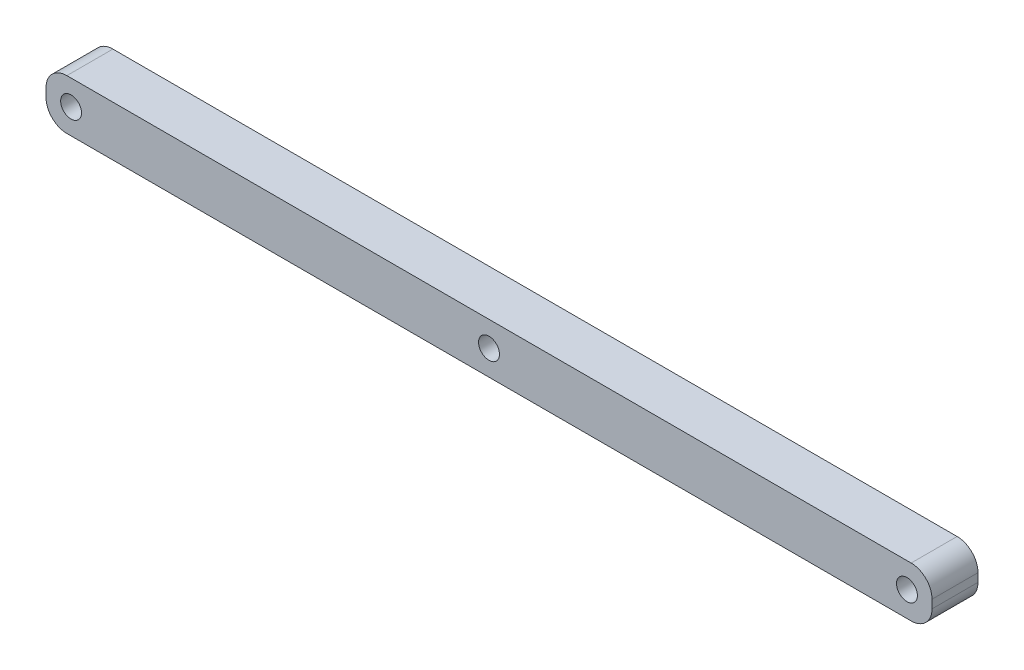
ISO-10303-21;
HEADER;
FILE_DESCRIPTION(('STEP AP214'),'2;1');
FILE_NAME('part.step','',(''),(''),'','','');
FILE_SCHEMA(('AUTOMOTIVE_DESIGN { 1 0 10303 214 1 1 1 1 }'));
ENDSEC;
DATA;
#1=APPLICATION_CONTEXT('core data for automotive mechanical design processes');
#2=APPLICATION_PROTOCOL_DEFINITION('international standard','automotive_design',2000,#1);
#3=PRODUCT_CONTEXT('',#1,'mechanical');
#4=PRODUCT('Part','Part','',(#3));
#5=PRODUCT_RELATED_PRODUCT_CATEGORY('part','',(#4));
#6=PRODUCT_DEFINITION_FORMATION('','',#4);
#7=PRODUCT_DEFINITION_CONTEXT('part definition',#1,'design');
#8=PRODUCT_DEFINITION('design','',#6,#7);
#9=PRODUCT_DEFINITION_SHAPE('','',#8);
#10=(LENGTH_UNIT() NAMED_UNIT(*) SI_UNIT(.MILLI.,.METRE.));
#11=(NAMED_UNIT(*) PLANE_ANGLE_UNIT() SI_UNIT($,.RADIAN.));
#12=(NAMED_UNIT(*) SI_UNIT($,.STERADIAN.) SOLID_ANGLE_UNIT());
#13=UNCERTAINTY_MEASURE_WITH_UNIT(LENGTH_MEASURE(1.E-05),#10,'distance_accuracy_value','');
#14=(GEOMETRIC_REPRESENTATION_CONTEXT(3) GLOBAL_UNCERTAINTY_ASSIGNED_CONTEXT((#13)) GLOBAL_UNIT_ASSIGNED_CONTEXT((#10,
#11,#12)) REPRESENTATION_CONTEXT('',''));
#15=CARTESIAN_POINT('',(0.,0.,0.));
#16=DIRECTION('',(0.,0.,1.));
#17=DIRECTION('',(1.,0.,0.));
#18=AXIS2_PLACEMENT_3D('',#15,#16,#17);
#19=CARTESIAN_POINT('',(0.,0.,22.));
#20=DIRECTION('',(0.,0.,-1.));
#21=DIRECTION('',(-1.,0.,0.));
#22=AXIS2_PLACEMENT_3D('',#19,#20,#21);
#23=PLANE('',#22);
#24=DIRECTION('',(0.,1.,0.));
#25=VECTOR('',#24,1.);
#26=CARTESIAN_POINT('',(424.,0.,22.));
#27=LINE('',#26,#25);
#28=CARTESIAN_POINT('',(424.,10.,22.));
#29=VERTEX_POINT('',#28);
#30=CARTESIAN_POINT('',(424.,14.,22.));
#31=VERTEX_POINT('',#30);
#32=EDGE_CURVE('E172',#29,#31,#27,.T.);
#33=ORIENTED_EDGE('',*,*,#32,.T.);
#34=CARTESIAN_POINT('',(414.,14.,22.));
#35=DIRECTION('',(0.,0.,-1.));
#36=DIRECTION('',(-1.,0.,0.));
#37=AXIS2_PLACEMENT_3D('',#34,#35,#36);
#38=CIRCLE('',#37,10.);
#39=CARTESIAN_POINT('',(414.,24.,22.));
#40=VERTEX_POINT('',#39);
#41=EDGE_CURVE('E149',#31,#40,#38,.F.);
#42=ORIENTED_EDGE('',*,*,#41,.T.);
#43=DIRECTION('',(-1.,0.,0.));
#44=VECTOR('',#43,1.);
#45=CARTESIAN_POINT('',(0.,24.,22.));
#46=LINE('',#45,#44);
#47=CARTESIAN_POINT('',(10.,24.,22.));
#48=VERTEX_POINT('',#47);
#49=EDGE_CURVE('E120',#40,#48,#46,.T.);
#50=ORIENTED_EDGE('',*,*,#49,.T.);
#51=CARTESIAN_POINT('',(10.,14.,22.));
#52=DIRECTION('',(0.,0.,-1.));
#53=DIRECTION('',(-1.,0.,0.));
#54=AXIS2_PLACEMENT_3D('',#51,#52,#53);
#55=CIRCLE('',#54,10.);
#56=CARTESIAN_POINT('',(0.,14.,22.));
#57=VERTEX_POINT('',#56);
#58=EDGE_CURVE('E145',#48,#57,#55,.F.);
#59=ORIENTED_EDGE('',*,*,#58,.T.);
#60=DIRECTION('',(0.,-1.,0.));
#61=VECTOR('',#60,1.);
#62=CARTESIAN_POINT('',(0.,0.,22.));
#63=LINE('',#62,#61);
#64=CARTESIAN_POINT('',(0.,10.,22.));
#65=VERTEX_POINT('',#64);
#66=EDGE_CURVE('E128',#57,#65,#63,.T.);
#67=ORIENTED_EDGE('',*,*,#66,.T.);
#68=CARTESIAN_POINT('',(10.,10.,22.));
#69=DIRECTION('',(0.,0.,-1.));
#70=DIRECTION('',(-1.,0.,0.));
#71=AXIS2_PLACEMENT_3D('',#68,#69,#70);
#72=CIRCLE('',#71,10.);
#73=CARTESIAN_POINT('',(10.,0.,22.));
#74=VERTEX_POINT('',#73);
#75=EDGE_CURVE('E55',#65,#74,#72,.F.);
#76=ORIENTED_EDGE('',*,*,#75,.T.);
#77=DIRECTION('',(1.,0.,0.));
#78=VECTOR('',#77,1.);
#79=CARTESIAN_POINT('',(0.,0.,22.));
#80=LINE('',#79,#78);
#81=CARTESIAN_POINT('',(414.,0.,22.));
#82=VERTEX_POINT('',#81);
#83=EDGE_CURVE('E131',#74,#82,#80,.T.);
#84=ORIENTED_EDGE('',*,*,#83,.T.);
#85=CARTESIAN_POINT('',(414.,10.,22.));
#86=DIRECTION('',(0.,0.,-1.));
#87=DIRECTION('',(-1.,0.,0.));
#88=AXIS2_PLACEMENT_3D('',#85,#86,#87);
#89=CIRCLE('',#88,10.);
#90=EDGE_CURVE('E147',#82,#29,#89,.F.);
#91=ORIENTED_EDGE('',*,*,#90,.T.);
#92=EDGE_LOOP('',(#33,#42,#50,#59,#67,#76,#84,#91));
#93=FACE_BOUND('',#92,.T.);
#94=CARTESIAN_POINT('',(12.,12.,22.));
#95=DIRECTION('',(0.,0.,1.));
#96=DIRECTION('',(1.,0.,0.));
#97=AXIS2_PLACEMENT_3D('',#94,#95,#96);
#98=CIRCLE('',#97,5.);
#99=CARTESIAN_POINT('',(17.,12.,22.));
#100=VERTEX_POINT('',#99);
#101=EDGE_CURVE('E168',#100,#100,#98,.T.);
#102=ORIENTED_EDGE('',*,*,#101,.F.);
#103=EDGE_LOOP('',(#102));
#104=FACE_BOUND('',#103,.T.);
#105=CARTESIAN_POINT('',(412.,12.,22.));
#106=DIRECTION('',(0.,0.,1.));
#107=DIRECTION('',(1.,0.,0.));
#108=AXIS2_PLACEMENT_3D('',#105,#106,#107);
#109=CIRCLE('',#108,4.99999999999999);
#110=CARTESIAN_POINT('',(417.,12.,22.));
#111=VERTEX_POINT('',#110);
#112=EDGE_CURVE('E178',#111,#111,#109,.T.);
#113=ORIENTED_EDGE('',*,*,#112,.F.);
#114=EDGE_LOOP('',(#113));
#115=FACE_BOUND('',#114,.T.);
#116=CARTESIAN_POINT('',(212.,12.,22.));
#117=DIRECTION('',(0.,0.,1.));
#118=DIRECTION('',(1.,0.,0.));
#119=AXIS2_PLACEMENT_3D('',#116,#117,#118);
#120=CIRCLE('',#119,4.99999999999999);
#121=CARTESIAN_POINT('',(217.,12.,22.));
#122=VERTEX_POINT('',#121);
#123=EDGE_CURVE('E184',#122,#122,#120,.T.);
#124=ORIENTED_EDGE('',*,*,#123,.F.);
#125=EDGE_LOOP('',(#124));
#126=FACE_BOUND('',#125,.T.);
#127=ADVANCED_FACE('F33',(#93,#104,#115,#126),#23,.F.);
#128=CARTESIAN_POINT('',(0.,0.,0.));
#129=DIRECTION('',(0.,0.,-1.));
#130=DIRECTION('',(-1.,0.,0.));
#131=AXIS2_PLACEMENT_3D('',#128,#129,#130);
#132=PLANE('',#131);
#133=CARTESIAN_POINT('',(412.,12.,0.));
#134=DIRECTION('',(0.,0.,1.));
#135=DIRECTION('',(1.,0.,0.));
#136=AXIS2_PLACEMENT_3D('',#133,#134,#135);
#137=CIRCLE('',#136,4.99999999999999);
#138=CARTESIAN_POINT('',(417.,12.,0.));
#139=VERTEX_POINT('',#138);
#140=EDGE_CURVE('E181',#139,#139,#137,.T.);
#141=ORIENTED_EDGE('',*,*,#140,.T.);
#142=EDGE_LOOP('',(#141));
#143=FACE_BOUND('',#142,.T.);
#144=DIRECTION('',(-1.,0.,0.));
#145=VECTOR('',#144,1.);
#146=CARTESIAN_POINT('',(0.,24.,0.));
#147=LINE('',#146,#145);
#148=CARTESIAN_POINT('',(414.,24.,0.));
#149=VERTEX_POINT('',#148);
#150=CARTESIAN_POINT('',(10.,24.,0.));
#151=VERTEX_POINT('',#150);
#152=EDGE_CURVE('E117',#149,#151,#147,.T.);
#153=ORIENTED_EDGE('',*,*,#152,.F.);
#154=CARTESIAN_POINT('',(414.,14.,0.));
#155=DIRECTION('',(0.,0.,-1.));
#156=DIRECTION('',(-1.,0.,0.));
#157=AXIS2_PLACEMENT_3D('',#154,#155,#156);
#158=CIRCLE('',#157,10.);
#159=CARTESIAN_POINT('',(424.,14.,0.));
#160=VERTEX_POINT('',#159);
#161=EDGE_CURVE('E100',#149,#160,#158,.T.);
#162=ORIENTED_EDGE('',*,*,#161,.T.);
#163=DIRECTION('',(0.,1.,0.));
#164=VECTOR('',#163,1.);
#165=CARTESIAN_POINT('',(424.,0.,0.));
#166=LINE('',#165,#164);
#167=CARTESIAN_POINT('',(424.,10.,0.));
#168=VERTEX_POINT('',#167);
#169=EDGE_CURVE('E129',#168,#160,#166,.T.);
#170=ORIENTED_EDGE('',*,*,#169,.F.);
#171=CARTESIAN_POINT('',(414.,10.,0.));
#172=DIRECTION('',(0.,0.,-1.));
#173=DIRECTION('',(-1.,0.,0.));
#174=AXIS2_PLACEMENT_3D('',#171,#172,#173);
#175=CIRCLE('',#174,10.);
#176=CARTESIAN_POINT('',(414.,0.,0.));
#177=VERTEX_POINT('',#176);
#178=EDGE_CURVE('E111',#168,#177,#175,.T.);
#179=ORIENTED_EDGE('',*,*,#178,.T.);
#180=DIRECTION('',(1.,0.,0.));
#181=VECTOR('',#180,1.);
#182=CARTESIAN_POINT('',(0.,0.,0.));
#183=LINE('',#182,#181);
#184=CARTESIAN_POINT('',(10.,0.,0.));
#185=VERTEX_POINT('',#184);
#186=EDGE_CURVE('E133',#185,#177,#183,.T.);
#187=ORIENTED_EDGE('',*,*,#186,.F.);
#188=CARTESIAN_POINT('',(10.,10.,0.));
#189=DIRECTION('',(0.,0.,-1.));
#190=DIRECTION('',(-1.,0.,0.));
#191=AXIS2_PLACEMENT_3D('',#188,#189,#190);
#192=CIRCLE('',#191,10.);
#193=CARTESIAN_POINT('',(0.,10.,0.));
#194=VERTEX_POINT('',#193);
#195=EDGE_CURVE('E121',#185,#194,#192,.T.);
#196=ORIENTED_EDGE('',*,*,#195,.T.);
#197=DIRECTION('',(0.,-1.,0.));
#198=VECTOR('',#197,1.);
#199=CARTESIAN_POINT('',(0.,0.,0.));
#200=LINE('',#199,#198);
#201=CARTESIAN_POINT('',(0.,14.,0.));
#202=VERTEX_POINT('',#201);
#203=EDGE_CURVE('E160',#202,#194,#200,.T.);
#204=ORIENTED_EDGE('',*,*,#203,.F.);
#205=CARTESIAN_POINT('',(10.,14.,0.));
#206=DIRECTION('',(0.,0.,-1.));
#207=DIRECTION('',(-1.,0.,0.));
#208=AXIS2_PLACEMENT_3D('',#205,#206,#207);
#209=CIRCLE('',#208,10.);
#210=EDGE_CURVE('E127',#202,#151,#209,.T.);
#211=ORIENTED_EDGE('',*,*,#210,.T.);
#212=EDGE_LOOP('',(#153,#162,#170,#179,#187,#196,#204,#211));
#213=FACE_BOUND('',#212,.T.);
#214=CARTESIAN_POINT('',(12.,12.,0.));
#215=DIRECTION('',(0.,0.,1.));
#216=DIRECTION('',(1.,0.,0.));
#217=AXIS2_PLACEMENT_3D('',#214,#215,#216);
#218=CIRCLE('',#217,5.);
#219=CARTESIAN_POINT('',(17.,12.,0.));
#220=VERTEX_POINT('',#219);
#221=EDGE_CURVE('E175',#220,#220,#218,.T.);
#222=ORIENTED_EDGE('',*,*,#221,.T.);
#223=EDGE_LOOP('',(#222));
#224=FACE_BOUND('',#223,.T.);
#225=CARTESIAN_POINT('',(212.,12.,0.));
#226=DIRECTION('',(0.,0.,1.));
#227=DIRECTION('',(1.,0.,0.));
#228=AXIS2_PLACEMENT_3D('',#225,#226,#227);
#229=CIRCLE('',#228,4.99999999999999);
#230=CARTESIAN_POINT('',(217.,12.,0.));
#231=VERTEX_POINT('',#230);
#232=EDGE_CURVE('E187',#231,#231,#229,.T.);
#233=ORIENTED_EDGE('',*,*,#232,.T.);
#234=EDGE_LOOP('',(#233));
#235=FACE_BOUND('',#234,.T.);
#236=ADVANCED_FACE('F124',(#143,#213,#224,#235),#132,.T.);
#237=CARTESIAN_POINT('',(0.,0.,22.));
#238=DIRECTION('',(1.,0.,0.));
#239=DIRECTION('',(0.,0.,-1.));
#240=AXIS2_PLACEMENT_3D('',#237,#238,#239);
#241=PLANE('',#240);
#242=ORIENTED_EDGE('',*,*,#66,.F.);
#243=DIRECTION('',(0.,0.,-1.));
#244=VECTOR('',#243,1.);
#245=CARTESIAN_POINT('',(0.,14.,22.));
#246=LINE('',#245,#244);
#247=EDGE_CURVE('E11',#57,#202,#246,.T.);
#248=ORIENTED_EDGE('',*,*,#247,.T.);
#249=ORIENTED_EDGE('',*,*,#203,.T.);
#250=DIRECTION('',(0.,0.,-1.));
#251=VECTOR('',#250,1.);
#252=CARTESIAN_POINT('',(0.,10.,22.));
#253=LINE('',#252,#251);
#254=EDGE_CURVE('E41',#194,#65,#253,.F.);
#255=ORIENTED_EDGE('',*,*,#254,.T.);
#256=EDGE_LOOP('',(#242,#248,#249,#255));
#257=FACE_BOUND('',#256,.T.);
#258=ADVANCED_FACE('F158',(#257),#241,.F.);
#259=CARTESIAN_POINT('',(0.,0.,22.));
#260=DIRECTION('',(0.,1.,0.));
#261=DIRECTION('',(0.,0.,1.));
#262=AXIS2_PLACEMENT_3D('',#259,#260,#261);
#263=PLANE('',#262);
#264=ORIENTED_EDGE('',*,*,#186,.T.);
#265=DIRECTION('',(0.,0.,-1.));
#266=VECTOR('',#265,1.);
#267=CARTESIAN_POINT('',(414.,0.,22.));
#268=LINE('',#267,#266);
#269=EDGE_CURVE('E48',#177,#82,#268,.F.);
#270=ORIENTED_EDGE('',*,*,#269,.T.);
#271=ORIENTED_EDGE('',*,*,#83,.F.);
#272=DIRECTION('',(0.,0.,-1.));
#273=VECTOR('',#272,1.);
#274=CARTESIAN_POINT('',(10.,0.,22.));
#275=LINE('',#274,#273);
#276=EDGE_CURVE('E151',#74,#185,#275,.T.);
#277=ORIENTED_EDGE('',*,*,#276,.T.);
#278=EDGE_LOOP('',(#264,#270,#271,#277));
#279=FACE_BOUND('',#278,.T.);
#280=ADVANCED_FACE('F167',(#279),#263,.F.);
#281=CARTESIAN_POINT('',(424.,0.,22.));
#282=DIRECTION('',(-1.,0.,0.));
#283=DIRECTION('',(0.,0.,1.));
#284=AXIS2_PLACEMENT_3D('',#281,#282,#283);
#285=PLANE('',#284);
#286=ORIENTED_EDGE('',*,*,#169,.T.);
#287=DIRECTION('',(0.,0.,-1.));
#288=VECTOR('',#287,1.);
#289=CARTESIAN_POINT('',(424.,14.,22.));
#290=LINE('',#289,#288);
#291=EDGE_CURVE('E105',#160,#31,#290,.F.);
#292=ORIENTED_EDGE('',*,*,#291,.T.);
#293=ORIENTED_EDGE('',*,*,#32,.F.);
#294=DIRECTION('',(0.,0.,-1.));
#295=VECTOR('',#294,1.);
#296=CARTESIAN_POINT('',(424.,10.,22.));
#297=LINE('',#296,#295);
#298=EDGE_CURVE('E110',#29,#168,#297,.T.);
#299=ORIENTED_EDGE('',*,*,#298,.T.);
#300=EDGE_LOOP('',(#286,#292,#293,#299));
#301=FACE_BOUND('',#300,.T.);
#302=ADVANCED_FACE('F209',(#301),#285,.F.);
#303=CARTESIAN_POINT('',(0.,24.,22.));
#304=DIRECTION('',(0.,-1.,0.));
#305=DIRECTION('',(0.,0.,-1.));
#306=AXIS2_PLACEMENT_3D('',#303,#304,#305);
#307=PLANE('',#306);
#308=ORIENTED_EDGE('',*,*,#49,.F.);
#309=DIRECTION('',(0.,0.,-1.));
#310=VECTOR('',#309,1.);
#311=CARTESIAN_POINT('',(414.,24.,22.));
#312=LINE('',#311,#310);
#313=EDGE_CURVE('E104',#40,#149,#312,.T.);
#314=ORIENTED_EDGE('',*,*,#313,.T.);
#315=ORIENTED_EDGE('',*,*,#152,.T.);
#316=DIRECTION('',(0.,0.,-1.));
#317=VECTOR('',#316,1.);
#318=CARTESIAN_POINT('',(10.,24.,22.));
#319=LINE('',#318,#317);
#320=EDGE_CURVE('E122',#151,#48,#319,.F.);
#321=ORIENTED_EDGE('',*,*,#320,.T.);
#322=EDGE_LOOP('',(#308,#314,#315,#321));
#323=FACE_BOUND('',#322,.T.);
#324=ADVANCED_FACE('F116',(#323),#307,.F.);
#325=CARTESIAN_POINT('',(12.,12.,22.));
#326=DIRECTION('',(0.,0.,-1.));
#327=DIRECTION('',(-1.,0.,0.));
#328=AXIS2_PLACEMENT_3D('',#325,#326,#327);
#329=CYLINDRICAL_SURFACE('',#328,5.);
#330=ORIENTED_EDGE('',*,*,#101,.T.);
#331=EDGE_LOOP('',(#330));
#332=FACE_BOUND('',#331,.T.);
#333=ORIENTED_EDGE('',*,*,#221,.F.);
#334=EDGE_LOOP('',(#333));
#335=FACE_BOUND('',#334,.T.);
#336=ADVANCED_FACE('F204',(#332,#335),#329,.F.);
#337=CARTESIAN_POINT('',(412.,12.,22.));
#338=DIRECTION('',(0.,0.,-1.));
#339=DIRECTION('',(-1.,0.,0.));
#340=AXIS2_PLACEMENT_3D('',#337,#338,#339);
#341=CYLINDRICAL_SURFACE('',#340,4.99999999999999);
#342=ORIENTED_EDGE('',*,*,#112,.T.);
#343=EDGE_LOOP('',(#342));
#344=FACE_BOUND('',#343,.T.);
#345=ORIENTED_EDGE('',*,*,#140,.F.);
#346=EDGE_LOOP('',(#345));
#347=FACE_BOUND('',#346,.T.);
#348=ADVANCED_FACE('F294',(#344,#347),#341,.F.);
#349=CARTESIAN_POINT('',(212.,12.,22.));
#350=DIRECTION('',(0.,0.,-1.));
#351=DIRECTION('',(-1.,0.,0.));
#352=AXIS2_PLACEMENT_3D('',#349,#350,#351);
#353=CYLINDRICAL_SURFACE('',#352,4.99999999999999);
#354=ORIENTED_EDGE('',*,*,#123,.T.);
#355=EDGE_LOOP('',(#354));
#356=FACE_BOUND('',#355,.T.);
#357=ORIENTED_EDGE('',*,*,#232,.F.);
#358=EDGE_LOOP('',(#357));
#359=FACE_BOUND('',#358,.T.);
#360=ADVANCED_FACE('F193',(#356,#359),#353,.F.);
#361=CARTESIAN_POINT('',(414.,14.,22.));
#362=DIRECTION('',(0.,0.,-1.));
#363=DIRECTION('',(-1.,0.,0.));
#364=AXIS2_PLACEMENT_3D('',#361,#362,#363);
#365=CYLINDRICAL_SURFACE('',#364,10.);
#366=ORIENTED_EDGE('',*,*,#41,.F.);
#367=ORIENTED_EDGE('',*,*,#291,.F.);
#368=ORIENTED_EDGE('',*,*,#161,.F.);
#369=ORIENTED_EDGE('',*,*,#313,.F.);
#370=EDGE_LOOP('',(#366,#367,#368,#369));
#371=FACE_BOUND('',#370,.T.);
#372=ADVANCED_FACE('F103',(#371),#365,.T.);
#373=CARTESIAN_POINT('',(414.,10.,22.));
#374=DIRECTION('',(0.,0.,-1.));
#375=DIRECTION('',(-1.,0.,0.));
#376=AXIS2_PLACEMENT_3D('',#373,#374,#375);
#377=CYLINDRICAL_SURFACE('',#376,10.);
#378=ORIENTED_EDGE('',*,*,#90,.F.);
#379=ORIENTED_EDGE('',*,*,#269,.F.);
#380=ORIENTED_EDGE('',*,*,#178,.F.);
#381=ORIENTED_EDGE('',*,*,#298,.F.);
#382=EDGE_LOOP('',(#378,#379,#380,#381));
#383=FACE_BOUND('',#382,.T.);
#384=ADVANCED_FACE('F219',(#383),#377,.T.);
#385=CARTESIAN_POINT('',(10.,14.,22.));
#386=DIRECTION('',(0.,0.,-1.));
#387=DIRECTION('',(-1.,0.,0.));
#388=AXIS2_PLACEMENT_3D('',#385,#386,#387);
#389=CYLINDRICAL_SURFACE('',#388,10.);
#390=ORIENTED_EDGE('',*,*,#58,.F.);
#391=ORIENTED_EDGE('',*,*,#320,.F.);
#392=ORIENTED_EDGE('',*,*,#210,.F.);
#393=ORIENTED_EDGE('',*,*,#247,.F.);
#394=EDGE_LOOP('',(#390,#391,#392,#393));
#395=FACE_BOUND('',#394,.T.);
#396=ADVANCED_FACE('F221',(#395),#389,.T.);
#397=CARTESIAN_POINT('',(10.,10.,22.));
#398=DIRECTION('',(0.,0.,-1.));
#399=DIRECTION('',(-1.,0.,0.));
#400=AXIS2_PLACEMENT_3D('',#397,#398,#399);
#401=CYLINDRICAL_SURFACE('',#400,10.);
#402=ORIENTED_EDGE('',*,*,#75,.F.);
#403=ORIENTED_EDGE('',*,*,#254,.F.);
#404=ORIENTED_EDGE('',*,*,#195,.F.);
#405=ORIENTED_EDGE('',*,*,#276,.F.);
#406=EDGE_LOOP('',(#402,#403,#404,#405));
#407=FACE_BOUND('',#406,.T.);
#408=ADVANCED_FACE('F35',(#407),#401,.T.);
#409=CLOSED_SHELL('',(#127,#236,#258,#280,#302,#324,#336,#348,#360,#372,#384,#396,#408));
#410=MANIFOLD_SOLID_BREP('B2',#409);
#411=ADVANCED_BREP_SHAPE_REPRESENTATION('',(#18,#410),#14);
#412=SHAPE_DEFINITION_REPRESENTATION(#9,#411);
ENDSEC;
END-ISO-10303-21;
